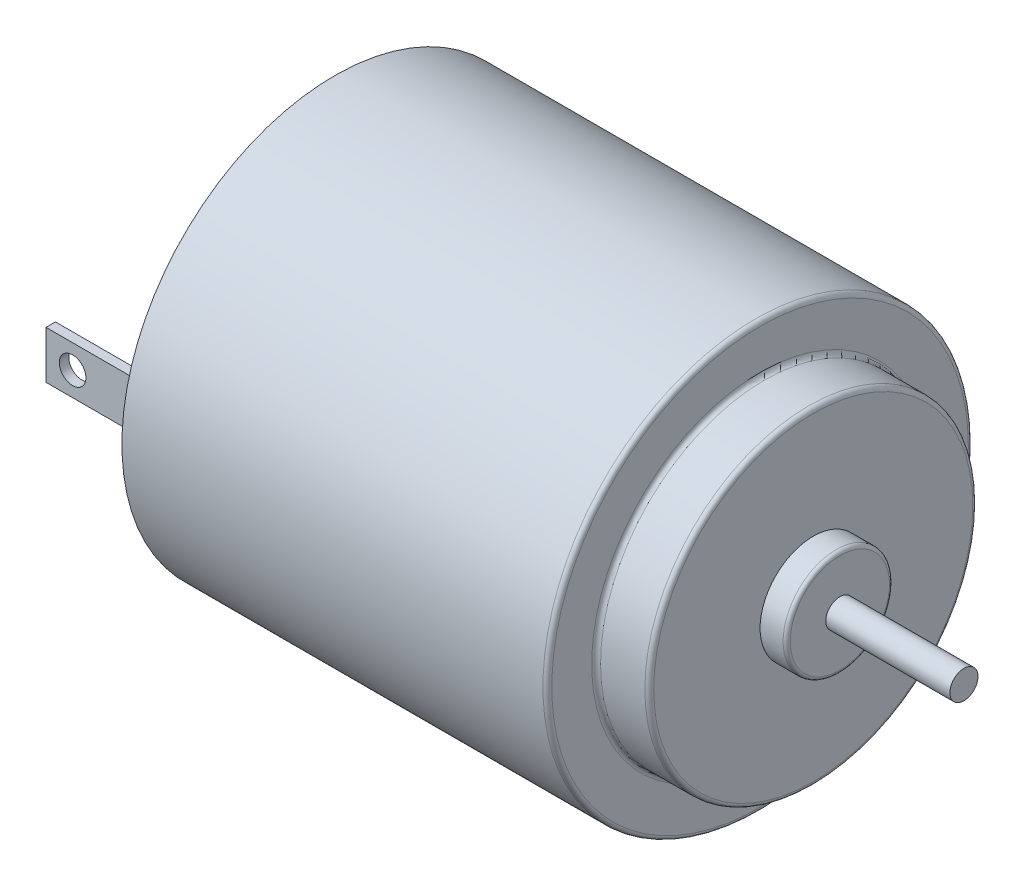
ISO-10303-21;
HEADER;
FILE_DESCRIPTION(('STEP AP214'),'2;1');
FILE_NAME('part.step','',(''),(''),'','','');
FILE_SCHEMA(('AUTOMOTIVE_DESIGN { 1 0 10303 214 1 1 1 1 }'));
ENDSEC;
DATA;
#1=APPLICATION_CONTEXT('core data for automotive mechanical design processes');
#2=APPLICATION_PROTOCOL_DEFINITION('international standard','automotive_design',2000,#1);
#3=PRODUCT_CONTEXT('',#1,'mechanical');
#4=PRODUCT('Part','Part','',(#3));
#5=PRODUCT_RELATED_PRODUCT_CATEGORY('part','',(#4));
#6=PRODUCT_DEFINITION_FORMATION('','',#4);
#7=PRODUCT_DEFINITION_CONTEXT('part definition',#1,'design');
#8=PRODUCT_DEFINITION('design','',#6,#7);
#9=PRODUCT_DEFINITION_SHAPE('','',#8);
#10=(LENGTH_UNIT() NAMED_UNIT(*) SI_UNIT(.MILLI.,.METRE.));
#11=(NAMED_UNIT(*) PLANE_ANGLE_UNIT() SI_UNIT($,.RADIAN.));
#12=(NAMED_UNIT(*) SI_UNIT($,.STERADIAN.) SOLID_ANGLE_UNIT());
#13=UNCERTAINTY_MEASURE_WITH_UNIT(LENGTH_MEASURE(1.E-05),#10,'distance_accuracy_value','');
#14=(GEOMETRIC_REPRESENTATION_CONTEXT(3) GLOBAL_UNCERTAINTY_ASSIGNED_CONTEXT((#13)) GLOBAL_UNIT_ASSIGNED_CONTEXT((#10,
#11,#12)) REPRESENTATION_CONTEXT('',''));
#15=CARTESIAN_POINT('',(0.,0.,0.));
#16=DIRECTION('',(0.,0.,1.));
#17=DIRECTION('',(1.,0.,0.));
#18=AXIS2_PLACEMENT_3D('',#15,#16,#17);
#19=CARTESIAN_POINT('',(-12.,0.,0.));
#20=DIRECTION('',(1.,0.,0.));
#21=DIRECTION('',(0.,0.,-1.));
#22=AXIS2_PLACEMENT_3D('',#19,#20,#21);
#23=PLANE('',#22);
#24=DIRECTION('',(0.,0.,-1.));
#25=VECTOR('',#24,1.);
#26=CARTESIAN_POINT('',(-12.,-1.34393994102311,-9.25));
#27=LINE('',#26,#25);
#28=CARTESIAN_POINT('',(-12.,-1.34393994102311,-9.25));
#29=VERTEX_POINT('',#28);
#30=CARTESIAN_POINT('',(-12.,-1.34393994102311,-9.7828248000751));
#31=VERTEX_POINT('',#30);
#32=EDGE_CURVE('E135',#29,#31,#27,.T.);
#33=ORIENTED_EDGE('',*,*,#32,.T.);
#34=DIRECTION('',(0.,1.,0.));
#35=VECTOR('',#34,1.);
#36=CARTESIAN_POINT('',(-12.,-1.34393994102311,-9.7828248000751));
#37=LINE('',#36,#35);
#38=CARTESIAN_POINT('',(-12.,1.34393994102311,-9.7828248000751));
#39=VERTEX_POINT('',#38);
#40=EDGE_CURVE('E108',#31,#39,#37,.T.);
#41=ORIENTED_EDGE('',*,*,#40,.T.);
#42=DIRECTION('',(0.,0.,1.));
#43=VECTOR('',#42,1.);
#44=CARTESIAN_POINT('',(-12.,1.34393994102311,-9.25));
#45=LINE('',#44,#43);
#46=CARTESIAN_POINT('',(-12.,1.34393994102311,-9.25));
#47=VERTEX_POINT('',#46);
#48=EDGE_CURVE('E124',#39,#47,#45,.T.);
#49=ORIENTED_EDGE('',*,*,#48,.T.);
#50=DIRECTION('',(0.,-1.,0.));
#51=VECTOR('',#50,1.);
#52=CARTESIAN_POINT('',(-12.,-1.34393994102311,-9.25));
#53=LINE('',#52,#51);
#54=EDGE_CURVE('E52',#47,#29,#53,.T.);
#55=ORIENTED_EDGE('',*,*,#54,.T.);
#56=EDGE_LOOP('',(#33,#41,#49,#55));
#57=FACE_BOUND('',#56,.T.);
#58=CARTESIAN_POINT('',(-12.,0.,0.));
#59=DIRECTION('',(1.,0.,0.));
#60=DIRECTION('',(0.,0.,-1.));
#61=AXIS2_PLACEMENT_3D('',#58,#59,#60);
#62=CIRCLE('',#61,12.);
#63=CARTESIAN_POINT('',(-12.,0.,-12.));
#64=VERTEX_POINT('',#63);
#65=EDGE_CURVE('E183',#64,#64,#62,.T.);
#66=ORIENTED_EDGE('',*,*,#65,.F.);
#67=EDGE_LOOP('',(#66));
#68=FACE_BOUND('',#67,.T.);
#69=DIRECTION('',(0.,1.,0.));
#70=VECTOR('',#69,1.);
#71=CARTESIAN_POINT('',(-12.,-1.34393994102311,9.7828248000751));
#72=LINE('',#71,#70);
#73=CARTESIAN_POINT('',(-12.,-1.34393994102311,9.7828248000751));
#74=VERTEX_POINT('',#73);
#75=CARTESIAN_POINT('',(-12.,1.34393994102311,9.7828248000751));
#76=VERTEX_POINT('',#75);
#77=EDGE_CURVE('E113',#74,#76,#72,.T.);
#78=ORIENTED_EDGE('',*,*,#77,.F.);
#79=DIRECTION('',(0.,0.,1.));
#80=VECTOR('',#79,1.);
#81=CARTESIAN_POINT('',(-12.,-1.34393994102311,9.25));
#82=LINE('',#81,#80);
#83=CARTESIAN_POINT('',(-12.,-1.34393994102311,9.25));
#84=VERTEX_POINT('',#83);
#85=EDGE_CURVE('E149',#84,#74,#82,.T.);
#86=ORIENTED_EDGE('',*,*,#85,.F.);
#87=DIRECTION('',(0.,-1.,0.));
#88=VECTOR('',#87,1.);
#89=CARTESIAN_POINT('',(-12.,-1.34393994102311,9.25));
#90=LINE('',#89,#88);
#91=CARTESIAN_POINT('',(-12.,1.34393994102311,9.25));
#92=VERTEX_POINT('',#91);
#93=EDGE_CURVE('E159',#92,#84,#90,.T.);
#94=ORIENTED_EDGE('',*,*,#93,.F.);
#95=DIRECTION('',(0.,0.,-1.));
#96=VECTOR('',#95,1.);
#97=CARTESIAN_POINT('',(-12.,1.34393994102311,9.25));
#98=LINE('',#97,#96);
#99=EDGE_CURVE('E60',#76,#92,#98,.T.);
#100=ORIENTED_EDGE('',*,*,#99,.F.);
#101=EDGE_LOOP('',(#78,#86,#94,#100));
#102=FACE_BOUND('',#101,.T.);
#103=ADVANCED_FACE('F36',(#57,#68,#102),#23,.F.);
#104=CARTESIAN_POINT('',(16.5,0.,0.));
#105=DIRECTION('',(1.,0.,0.));
#106=DIRECTION('',(0.,0.,-1.));
#107=AXIS2_PLACEMENT_3D('',#104,#105,#106);
#108=PLANE('',#107);
#109=CARTESIAN_POINT('',(16.5,0.,0.));
#110=DIRECTION('',(1.,0.,0.));
#111=DIRECTION('',(0.,0.,-1.));
#112=AXIS2_PLACEMENT_3D('',#109,#110,#111);
#113=CIRCLE('',#112,2.8);
#114=CARTESIAN_POINT('',(16.5,0.,-2.8));
#115=VERTEX_POINT('',#114);
#116=EDGE_CURVE('E45',#115,#115,#113,.T.);
#117=ORIENTED_EDGE('',*,*,#116,.T.);
#118=EDGE_LOOP('',(#117));
#119=FACE_BOUND('',#118,.T.);
#120=CARTESIAN_POINT('',(16.5,0.,0.));
#121=DIRECTION('',(1.,0.,0.));
#122=DIRECTION('',(0.,0.,-1.));
#123=AXIS2_PLACEMENT_3D('',#120,#121,#122);
#124=CIRCLE('',#123,0.79375);
#125=CARTESIAN_POINT('',(16.5,0.,-0.79375));
#126=VERTEX_POINT('',#125);
#127=EDGE_CURVE('E174',#126,#126,#124,.T.);
#128=ORIENTED_EDGE('',*,*,#127,.F.);
#129=EDGE_LOOP('',(#128));
#130=FACE_BOUND('',#129,.T.);
#131=ADVANCED_FACE('F207',(#119,#130),#108,.T.);
#132=CARTESIAN_POINT('',(15.,0.,0.));
#133=DIRECTION('',(1.,0.,0.));
#134=DIRECTION('',(0.,0.,-1.));
#135=AXIS2_PLACEMENT_3D('',#132,#133,#134);
#136=PLANE('',#135);
#137=CARTESIAN_POINT('',(15.,0.,0.));
#138=DIRECTION('',(1.,0.,0.));
#139=DIRECTION('',(0.,0.,-1.));
#140=AXIS2_PLACEMENT_3D('',#137,#138,#139);
#141=CIRCLE('',#140,9.);
#142=CARTESIAN_POINT('',(15.,0.,-9.));
#143=VERTEX_POINT('',#142);
#144=EDGE_CURVE('E186',#143,#143,#141,.T.);
#145=ORIENTED_EDGE('',*,*,#144,.T.);
#146=EDGE_LOOP('',(#145));
#147=FACE_BOUND('',#146,.T.);
#148=CARTESIAN_POINT('',(15.,0.,0.));
#149=DIRECTION('',(1.,0.,0.));
#150=DIRECTION('',(0.,0.,-1.));
#151=AXIS2_PLACEMENT_3D('',#148,#149,#150);
#152=CIRCLE('',#151,3.);
#153=CARTESIAN_POINT('',(15.,0.,-3.));
#154=VERTEX_POINT('',#153);
#155=EDGE_CURVE('E178',#154,#154,#152,.T.);
#156=ORIENTED_EDGE('',*,*,#155,.F.);
#157=EDGE_LOOP('',(#156));
#158=FACE_BOUND('',#157,.T.);
#159=ADVANCED_FACE('F230',(#147,#158),#136,.T.);
#160=CARTESIAN_POINT('',(12.,0.,0.));
#161=DIRECTION('',(1.,0.,0.));
#162=DIRECTION('',(0.,0.,-1.));
#163=AXIS2_PLACEMENT_3D('',#160,#161,#162);
#164=PLANE('',#163);
#165=CARTESIAN_POINT('',(12.,0.,0.));
#166=DIRECTION('',(1.,0.,0.));
#167=DIRECTION('',(0.,0.,-1.));
#168=AXIS2_PLACEMENT_3D('',#165,#166,#167);
#169=CIRCLE('',#168,9.5);
#170=CARTESIAN_POINT('',(12.,0.,-9.5));
#171=VERTEX_POINT('',#170);
#172=EDGE_CURVE('E198',#171,#171,#169,.F.);
#173=ORIENTED_EDGE('',*,*,#172,.T.);
#174=EDGE_LOOP('',(#173));
#175=FACE_BOUND('',#174,.T.);
#176=CARTESIAN_POINT('',(12.,0.,0.));
#177=DIRECTION('',(1.,0.,0.));
#178=DIRECTION('',(0.,0.,-1.));
#179=AXIS2_PLACEMENT_3D('',#176,#177,#178);
#180=CIRCLE('',#179,11.75);
#181=CARTESIAN_POINT('',(12.,0.,-11.75));
#182=VERTEX_POINT('',#181);
#183=EDGE_CURVE('E195',#182,#182,#180,.T.);
#184=ORIENTED_EDGE('',*,*,#183,.T.);
#185=EDGE_LOOP('',(#184));
#186=FACE_BOUND('',#185,.T.);
#187=ADVANCED_FACE('F235',(#175,#186),#164,.T.);
#188=CARTESIAN_POINT('',(-12.,0.,0.));
#189=DIRECTION('',(1.,0.,0.));
#190=DIRECTION('',(0.,0.,-1.));
#191=AXIS2_PLACEMENT_3D('',#188,#189,#190);
#192=CYLINDRICAL_SURFACE('',#191,12.);
#193=CARTESIAN_POINT('',(11.75,0.,0.));
#194=DIRECTION('',(1.,0.,0.));
#195=DIRECTION('',(0.,0.,-1.));
#196=AXIS2_PLACEMENT_3D('',#193,#194,#195);
#197=CIRCLE('',#196,12.);
#198=CARTESIAN_POINT('',(11.75,0.,-12.));
#199=VERTEX_POINT('',#198);
#200=EDGE_CURVE('E201',#199,#199,#197,.F.);
#201=ORIENTED_EDGE('',*,*,#200,.T.);
#202=EDGE_LOOP('',(#201));
#203=FACE_BOUND('',#202,.T.);
#204=ORIENTED_EDGE('',*,*,#65,.T.);
#205=EDGE_LOOP('',(#204));
#206=FACE_BOUND('',#205,.T.);
#207=ADVANCED_FACE('F237',(#203,#206),#192,.T.);
#208=CARTESIAN_POINT('',(15.,0.,0.));
#209=DIRECTION('',(-1.,0.,0.));
#210=DIRECTION('',(0.,0.,1.));
#211=AXIS2_PLACEMENT_3D('',#208,#209,#210);
#212=CYLINDRICAL_SURFACE('',#211,9.25);
#213=CARTESIAN_POINT('',(14.75,0.,0.));
#214=DIRECTION('',(1.,0.,0.));
#215=DIRECTION('',(0.,0.,-1.));
#216=AXIS2_PLACEMENT_3D('',#213,#214,#215);
#217=CIRCLE('',#216,9.25);
#218=CARTESIAN_POINT('',(14.75,0.,-9.25));
#219=VERTEX_POINT('',#218);
#220=EDGE_CURVE('E192',#219,#219,#217,.F.);
#221=ORIENTED_EDGE('',*,*,#220,.T.);
#222=EDGE_LOOP('',(#221));
#223=FACE_BOUND('',#222,.T.);
#224=CARTESIAN_POINT('',(12.25,0.,0.));
#225=DIRECTION('',(1.,0.,0.));
#226=DIRECTION('',(0.,0.,-1.));
#227=AXIS2_PLACEMENT_3D('',#224,#225,#226);
#228=CIRCLE('',#227,9.25);
#229=CARTESIAN_POINT('',(12.25,0.,-9.25));
#230=VERTEX_POINT('',#229);
#231=EDGE_CURVE('E189',#230,#230,#228,.T.);
#232=ORIENTED_EDGE('',*,*,#231,.T.);
#233=EDGE_LOOP('',(#232));
#234=FACE_BOUND('',#233,.T.);
#235=ADVANCED_FACE('F240',(#223,#234),#212,.T.);
#236=CARTESIAN_POINT('',(16.5,0.,0.));
#237=DIRECTION('',(-1.,0.,0.));
#238=DIRECTION('',(0.,0.,1.));
#239=AXIS2_PLACEMENT_3D('',#236,#237,#238);
#240=CYLINDRICAL_SURFACE('',#239,3.);
#241=CARTESIAN_POINT('',(16.3,0.,0.));
#242=DIRECTION('',(1.,0.,0.));
#243=DIRECTION('',(0.,0.,-1.));
#244=AXIS2_PLACEMENT_3D('',#241,#242,#243);
#245=CIRCLE('',#244,3.);
#246=CARTESIAN_POINT('',(16.3,0.,-3.));
#247=VERTEX_POINT('',#246);
#248=EDGE_CURVE('E11',#247,#247,#245,.F.);
#249=ORIENTED_EDGE('',*,*,#248,.T.);
#250=EDGE_LOOP('',(#249));
#251=FACE_BOUND('',#250,.T.);
#252=ORIENTED_EDGE('',*,*,#155,.T.);
#253=EDGE_LOOP('',(#252));
#254=FACE_BOUND('',#253,.T.);
#255=ADVANCED_FACE('F256',(#251,#254),#240,.T.);
#256=CARTESIAN_POINT('',(23.5,0.,0.));
#257=DIRECTION('',(-1.,0.,0.));
#258=DIRECTION('',(0.,0.,1.));
#259=AXIS2_PLACEMENT_3D('',#256,#257,#258);
#260=CYLINDRICAL_SURFACE('',#259,0.79375);
#261=CARTESIAN_POINT('',(23.5,0.,0.));
#262=DIRECTION('',(1.,0.,0.));
#263=DIRECTION('',(0.,0.,-1.));
#264=AXIS2_PLACEMENT_3D('',#261,#262,#263);
#265=CIRCLE('',#264,0.79375);
#266=CARTESIAN_POINT('',(23.5,0.,-0.79375));
#267=VERTEX_POINT('',#266);
#268=EDGE_CURVE('E175',#267,#267,#265,.T.);
#269=ORIENTED_EDGE('',*,*,#268,.F.);
#270=EDGE_LOOP('',(#269));
#271=FACE_BOUND('',#270,.T.);
#272=ORIENTED_EDGE('',*,*,#127,.T.);
#273=EDGE_LOOP('',(#272));
#274=FACE_BOUND('',#273,.T.);
#275=ADVANCED_FACE('F261',(#271,#274),#260,.T.);
#276=CARTESIAN_POINT('',(23.5,0.,0.));
#277=DIRECTION('',(1.,0.,0.));
#278=DIRECTION('',(0.,0.,-1.));
#279=AXIS2_PLACEMENT_3D('',#276,#277,#278);
#280=PLANE('',#279);
#281=ORIENTED_EDGE('',*,*,#268,.T.);
#282=EDGE_LOOP('',(#281));
#283=FACE_BOUND('',#282,.T.);
#284=ADVANCED_FACE('F245',(#283),#280,.T.);
#285=CARTESIAN_POINT('',(14.75,0.,0.));
#286=DIRECTION('',(1.,0.,0.));
#287=DIRECTION('',(0.,0.,-1.));
#288=AXIS2_PLACEMENT_3D('',#285,#286,#287);
#289=TOROIDAL_SURFACE('',#288,9.,0.25);
#290=ORIENTED_EDGE('',*,*,#220,.F.);
#291=EDGE_LOOP('',(#290));
#292=FACE_BOUND('',#291,.T.);
#293=ORIENTED_EDGE('',*,*,#144,.F.);
#294=EDGE_LOOP('',(#293));
#295=FACE_BOUND('',#294,.T.);
#296=ADVANCED_FACE('F242',(#292,#295),#289,.T.);
#297=CARTESIAN_POINT('',(12.25,0.,0.));
#298=DIRECTION('',(1.,0.,0.));
#299=DIRECTION('',(0.,0.,-1.));
#300=AXIS2_PLACEMENT_3D('',#297,#298,#299);
#301=TOROIDAL_SURFACE('',#300,9.5,0.25);
#302=ORIENTED_EDGE('',*,*,#172,.F.);
#303=EDGE_LOOP('',(#302));
#304=FACE_BOUND('',#303,.T.);
#305=ORIENTED_EDGE('',*,*,#231,.F.);
#306=EDGE_LOOP('',(#305));
#307=FACE_BOUND('',#306,.T.);
#308=ADVANCED_FACE('F221',(#304,#307),#301,.F.);
#309=CARTESIAN_POINT('',(11.75,0.,0.));
#310=DIRECTION('',(1.,0.,0.));
#311=DIRECTION('',(0.,0.,-1.));
#312=AXIS2_PLACEMENT_3D('',#309,#310,#311);
#313=TOROIDAL_SURFACE('',#312,11.75,0.25);
#314=ORIENTED_EDGE('',*,*,#200,.F.);
#315=EDGE_LOOP('',(#314));
#316=FACE_BOUND('',#315,.T.);
#317=ORIENTED_EDGE('',*,*,#183,.F.);
#318=EDGE_LOOP('',(#317));
#319=FACE_BOUND('',#318,.T.);
#320=ADVANCED_FACE('F212',(#316,#319),#313,.T.);
#321=CARTESIAN_POINT('',(16.3,0.,0.));
#322=DIRECTION('',(1.,0.,0.));
#323=DIRECTION('',(0.,0.,-1.));
#324=AXIS2_PLACEMENT_3D('',#321,#322,#323);
#325=TOROIDAL_SURFACE('',#324,2.8,0.2);
#326=ORIENTED_EDGE('',*,*,#248,.F.);
#327=EDGE_LOOP('',(#326));
#328=FACE_BOUND('',#327,.T.);
#329=ORIENTED_EDGE('',*,*,#116,.F.);
#330=EDGE_LOOP('',(#329));
#331=FACE_BOUND('',#330,.T.);
#332=ADVANCED_FACE('F38',(#328,#331),#325,.T.);
#333=CARTESIAN_POINT('',(-18.5,-1.34393994102311,9.7828248000751));
#334=DIRECTION('',(0.,0.,-1.));
#335=DIRECTION('',(-1.,0.,0.));
#336=AXIS2_PLACEMENT_3D('',#333,#334,#335);
#337=PLANE('',#336);
#338=CARTESIAN_POINT('',(-17.,0.,9.7828248000751));
#339=DIRECTION('',(0.,0.,1.));
#340=DIRECTION('',(1.,0.,0.));
#341=AXIS2_PLACEMENT_3D('',#338,#339,#340);
#342=CIRCLE('',#341,0.750000000000002);
#343=CARTESIAN_POINT('',(-16.25,0.,9.7828248000751));
#344=VERTEX_POINT('',#343);
#345=EDGE_CURVE('E318',#344,#344,#342,.T.);
#346=ORIENTED_EDGE('',*,*,#345,.F.);
#347=EDGE_LOOP('',(#346));
#348=FACE_BOUND('',#347,.T.);
#349=ORIENTED_EDGE('',*,*,#77,.T.);
#350=DIRECTION('',(1.,0.,0.));
#351=VECTOR('',#350,1.);
#352=CARTESIAN_POINT('',(-18.5,1.34393994102311,9.7828248000751));
#353=LINE('',#352,#351);
#354=CARTESIAN_POINT('',(-18.5,1.34393994102311,9.7828248000751));
#355=VERTEX_POINT('',#354);
#356=EDGE_CURVE('E172',#355,#76,#353,.T.);
#357=ORIENTED_EDGE('',*,*,#356,.F.);
#358=DIRECTION('',(0.,1.,0.));
#359=VECTOR('',#358,1.);
#360=CARTESIAN_POINT('',(-18.5,-1.34393994102311,9.7828248000751));
#361=LINE('',#360,#359);
#362=CARTESIAN_POINT('',(-18.5,-1.34393994102311,9.7828248000751));
#363=VERTEX_POINT('',#362);
#364=EDGE_CURVE('E145',#363,#355,#361,.T.);
#365=ORIENTED_EDGE('',*,*,#364,.F.);
#366=DIRECTION('',(1.,0.,0.));
#367=VECTOR('',#366,1.);
#368=CARTESIAN_POINT('',(-18.5,-1.34393994102311,9.7828248000751));
#369=LINE('',#368,#367);
#370=EDGE_CURVE('E155',#363,#74,#369,.T.);
#371=ORIENTED_EDGE('',*,*,#370,.T.);
#372=EDGE_LOOP('',(#349,#357,#365,#371));
#373=FACE_BOUND('',#372,.T.);
#374=ADVANCED_FACE('F211',(#348,#373),#337,.F.);
#375=CARTESIAN_POINT('',(-18.5,1.34393994102311,9.25));
#376=DIRECTION('',(0.,-1.,0.));
#377=DIRECTION('',(0.,0.,-1.));
#378=AXIS2_PLACEMENT_3D('',#375,#376,#377);
#379=PLANE('',#378);
#380=ORIENTED_EDGE('',*,*,#99,.T.);
#381=DIRECTION('',(1.,0.,0.));
#382=VECTOR('',#381,1.);
#383=CARTESIAN_POINT('',(-18.5,1.34393994102311,9.25));
#384=LINE('',#383,#382);
#385=CARTESIAN_POINT('',(-18.5,1.34393994102311,9.25));
#386=VERTEX_POINT('',#385);
#387=EDGE_CURVE('E169',#386,#92,#384,.T.);
#388=ORIENTED_EDGE('',*,*,#387,.F.);
#389=DIRECTION('',(0.,0.,-1.));
#390=VECTOR('',#389,1.);
#391=CARTESIAN_POINT('',(-18.5,1.34393994102311,9.25));
#392=LINE('',#391,#390);
#393=EDGE_CURVE('E148',#355,#386,#392,.T.);
#394=ORIENTED_EDGE('',*,*,#393,.F.);
#395=ORIENTED_EDGE('',*,*,#356,.T.);
#396=EDGE_LOOP('',(#380,#388,#394,#395));
#397=FACE_BOUND('',#396,.T.);
#398=ADVANCED_FACE('F218',(#397),#379,.F.);
#399=CARTESIAN_POINT('',(-18.5,-1.34393994102311,9.25));
#400=DIRECTION('',(0.,0.,1.));
#401=DIRECTION('',(1.,0.,0.));
#402=AXIS2_PLACEMENT_3D('',#399,#400,#401);
#403=PLANE('',#402);
#404=CARTESIAN_POINT('',(-17.,0.,9.25));
#405=DIRECTION('',(0.,0.,1.));
#406=DIRECTION('',(1.,0.,0.));
#407=AXIS2_PLACEMENT_3D('',#404,#405,#406);
#408=CIRCLE('',#407,0.750000000000002);
#409=CARTESIAN_POINT('',(-16.25,0.,9.25));
#410=VERTEX_POINT('',#409);
#411=EDGE_CURVE('E136',#410,#410,#408,.T.);
#412=ORIENTED_EDGE('',*,*,#411,.T.);
#413=EDGE_LOOP('',(#412));
#414=FACE_BOUND('',#413,.T.);
#415=ORIENTED_EDGE('',*,*,#93,.T.);
#416=DIRECTION('',(1.,0.,0.));
#417=VECTOR('',#416,1.);
#418=CARTESIAN_POINT('',(-18.5,-1.34393994102311,9.25));
#419=LINE('',#418,#417);
#420=CARTESIAN_POINT('',(-18.5,-1.34393994102311,9.25));
#421=VERTEX_POINT('',#420);
#422=EDGE_CURVE('E166',#421,#84,#419,.T.);
#423=ORIENTED_EDGE('',*,*,#422,.F.);
#424=DIRECTION('',(0.,-1.,0.));
#425=VECTOR('',#424,1.);
#426=CARTESIAN_POINT('',(-18.5,-1.34393994102311,9.25));
#427=LINE('',#426,#425);
#428=EDGE_CURVE('E151',#386,#421,#427,.T.);
#429=ORIENTED_EDGE('',*,*,#428,.F.);
#430=ORIENTED_EDGE('',*,*,#387,.T.);
#431=EDGE_LOOP('',(#415,#423,#429,#430));
#432=FACE_BOUND('',#431,.T.);
#433=ADVANCED_FACE('F276',(#414,#432),#403,.F.);
#434=CARTESIAN_POINT('',(-18.5,-1.34393994102311,9.25));
#435=DIRECTION('',(0.,1.,0.));
#436=DIRECTION('',(0.,0.,1.));
#437=AXIS2_PLACEMENT_3D('',#434,#435,#436);
#438=PLANE('',#437);
#439=ORIENTED_EDGE('',*,*,#85,.T.);
#440=ORIENTED_EDGE('',*,*,#370,.F.);
#441=DIRECTION('',(0.,0.,1.));
#442=VECTOR('',#441,1.);
#443=CARTESIAN_POINT('',(-18.5,-1.34393994102311,9.25));
#444=LINE('',#443,#442);
#445=EDGE_CURVE('E153',#421,#363,#444,.T.);
#446=ORIENTED_EDGE('',*,*,#445,.F.);
#447=ORIENTED_EDGE('',*,*,#422,.T.);
#448=EDGE_LOOP('',(#439,#440,#446,#447));
#449=FACE_BOUND('',#448,.T.);
#450=ADVANCED_FACE('F280',(#449),#438,.F.);
#451=CARTESIAN_POINT('',(-18.5,0.,0.));
#452=DIRECTION('',(1.,0.,0.));
#453=DIRECTION('',(0.,0.,-1.));
#454=AXIS2_PLACEMENT_3D('',#451,#452,#453);
#455=PLANE('',#454);
#456=ORIENTED_EDGE('',*,*,#364,.T.);
#457=ORIENTED_EDGE('',*,*,#393,.T.);
#458=ORIENTED_EDGE('',*,*,#428,.T.);
#459=ORIENTED_EDGE('',*,*,#445,.T.);
#460=EDGE_LOOP('',(#456,#457,#458,#459));
#461=FACE_BOUND('',#460,.T.);
#462=ADVANCED_FACE('F284',(#461),#455,.F.);
#463=CARTESIAN_POINT('',(-18.5,-1.34393994102311,-9.7828248000751));
#464=DIRECTION('',(0.,0.,-1.));
#465=DIRECTION('',(-1.,0.,0.));
#466=AXIS2_PLACEMENT_3D('',#463,#464,#465);
#467=PLANE('',#466);
#468=CARTESIAN_POINT('',(-17.,0.,-9.7828248000751));
#469=DIRECTION('',(0.,0.,-1.));
#470=DIRECTION('',(-1.,0.,0.));
#471=AXIS2_PLACEMENT_3D('',#468,#469,#470);
#472=CIRCLE('',#471,0.750000000000002);
#473=CARTESIAN_POINT('',(-16.25,0.,-9.7828248000751));
#474=VERTEX_POINT('',#473);
#475=EDGE_CURVE('E315',#474,#474,#472,.T.);
#476=ORIENTED_EDGE('',*,*,#475,.F.);
#477=EDGE_LOOP('',(#476));
#478=FACE_BOUND('',#477,.T.);
#479=ORIENTED_EDGE('',*,*,#40,.F.);
#480=DIRECTION('',(1.,0.,0.));
#481=VECTOR('',#480,1.);
#482=CARTESIAN_POINT('',(-18.5,-1.34393994102311,-9.7828248000751));
#483=LINE('',#482,#481);
#484=CARTESIAN_POINT('',(-18.5,-1.34393994102311,-9.7828248000751));
#485=VERTEX_POINT('',#484);
#486=EDGE_CURVE('E102',#485,#31,#483,.T.);
#487=ORIENTED_EDGE('',*,*,#486,.F.);
#488=DIRECTION('',(0.,1.,0.));
#489=VECTOR('',#488,1.);
#490=CARTESIAN_POINT('',(-18.5,-1.34393994102311,-9.7828248000751));
#491=LINE('',#490,#489);
#492=CARTESIAN_POINT('',(-18.5,1.34393994102311,-9.7828248000751));
#493=VERTEX_POINT('',#492);
#494=EDGE_CURVE('E105',#485,#493,#491,.T.);
#495=ORIENTED_EDGE('',*,*,#494,.T.);
#496=DIRECTION('',(1.,0.,0.));
#497=VECTOR('',#496,1.);
#498=CARTESIAN_POINT('',(-18.5,1.34393994102311,-9.7828248000751));
#499=LINE('',#498,#497);
#500=EDGE_CURVE('E133',#493,#39,#499,.T.);
#501=ORIENTED_EDGE('',*,*,#500,.T.);
#502=EDGE_LOOP('',(#479,#487,#495,#501));
#503=FACE_BOUND('',#502,.T.);
#504=ADVANCED_FACE('F104',(#478,#503),#467,.T.);
#505=CARTESIAN_POINT('',(-18.5,-1.34393994102311,-9.25));
#506=DIRECTION('',(0.,-1.,0.));
#507=DIRECTION('',(0.,0.,-1.));
#508=AXIS2_PLACEMENT_3D('',#505,#506,#507);
#509=PLANE('',#508);
#510=ORIENTED_EDGE('',*,*,#32,.F.);
#511=DIRECTION('',(1.,0.,0.));
#512=VECTOR('',#511,1.);
#513=CARTESIAN_POINT('',(-18.5,-1.34393994102311,-9.25));
#514=LINE('',#513,#512);
#515=CARTESIAN_POINT('',(-18.5,-1.34393994102311,-9.25));
#516=VERTEX_POINT('',#515);
#517=EDGE_CURVE('E114',#516,#29,#514,.T.);
#518=ORIENTED_EDGE('',*,*,#517,.F.);
#519=DIRECTION('',(0.,0.,-1.));
#520=VECTOR('',#519,1.);
#521=CARTESIAN_POINT('',(-18.5,-1.34393994102311,-9.25));
#522=LINE('',#521,#520);
#523=EDGE_CURVE('E120',#516,#485,#522,.T.);
#524=ORIENTED_EDGE('',*,*,#523,.T.);
#525=ORIENTED_EDGE('',*,*,#486,.T.);
#526=EDGE_LOOP('',(#510,#518,#524,#525));
#527=FACE_BOUND('',#526,.T.);
#528=ADVANCED_FACE('F126',(#527),#509,.T.);
#529=CARTESIAN_POINT('',(-18.5,-1.34393994102311,-9.25));
#530=DIRECTION('',(0.,0.,1.));
#531=DIRECTION('',(1.,0.,0.));
#532=AXIS2_PLACEMENT_3D('',#529,#530,#531);
#533=PLANE('',#532);
#534=CARTESIAN_POINT('',(-17.,0.,-9.25));
#535=DIRECTION('',(0.,0.,1.));
#536=DIRECTION('',(1.,0.,0.));
#537=AXIS2_PLACEMENT_3D('',#534,#535,#536);
#538=CIRCLE('',#537,0.750000000000002);
#539=CARTESIAN_POINT('',(-16.25,0.,-9.25));
#540=VERTEX_POINT('',#539);
#541=EDGE_CURVE('E40',#540,#540,#538,.T.);
#542=ORIENTED_EDGE('',*,*,#541,.F.);
#543=EDGE_LOOP('',(#542));
#544=FACE_BOUND('',#543,.T.);
#545=ORIENTED_EDGE('',*,*,#54,.F.);
#546=DIRECTION('',(1.,0.,0.));
#547=VECTOR('',#546,1.);
#548=CARTESIAN_POINT('',(-18.5,1.34393994102311,-9.25));
#549=LINE('',#548,#547);
#550=CARTESIAN_POINT('',(-18.5,1.34393994102311,-9.25));
#551=VERTEX_POINT('',#550);
#552=EDGE_CURVE('E142',#551,#47,#549,.T.);
#553=ORIENTED_EDGE('',*,*,#552,.F.);
#554=DIRECTION('',(0.,-1.,0.));
#555=VECTOR('',#554,1.);
#556=CARTESIAN_POINT('',(-18.5,-1.34393994102311,-9.25));
#557=LINE('',#556,#555);
#558=EDGE_CURVE('E127',#551,#516,#557,.T.);
#559=ORIENTED_EDGE('',*,*,#558,.T.);
#560=ORIENTED_EDGE('',*,*,#517,.T.);
#561=EDGE_LOOP('',(#545,#553,#559,#560));
#562=FACE_BOUND('',#561,.T.);
#563=ADVANCED_FACE('F294',(#544,#562),#533,.T.);
#564=CARTESIAN_POINT('',(-18.5,1.34393994102311,-9.25));
#565=DIRECTION('',(0.,1.,0.));
#566=DIRECTION('',(0.,0.,1.));
#567=AXIS2_PLACEMENT_3D('',#564,#565,#566);
#568=PLANE('',#567);
#569=ORIENTED_EDGE('',*,*,#48,.F.);
#570=ORIENTED_EDGE('',*,*,#500,.F.);
#571=DIRECTION('',(0.,0.,1.));
#572=VECTOR('',#571,1.);
#573=CARTESIAN_POINT('',(-18.5,1.34393994102311,-9.25));
#574=LINE('',#573,#572);
#575=EDGE_CURVE('E123',#493,#551,#574,.T.);
#576=ORIENTED_EDGE('',*,*,#575,.T.);
#577=ORIENTED_EDGE('',*,*,#552,.T.);
#578=EDGE_LOOP('',(#569,#570,#576,#577));
#579=FACE_BOUND('',#578,.T.);
#580=ADVANCED_FACE('F297',(#579),#568,.T.);
#581=CARTESIAN_POINT('',(-18.5,0.,0.));
#582=DIRECTION('',(1.,0.,0.));
#583=DIRECTION('',(0.,0.,1.));
#584=AXIS2_PLACEMENT_3D('',#581,#582,#583);
#585=PLANE('',#584);
#586=ORIENTED_EDGE('',*,*,#494,.F.);
#587=ORIENTED_EDGE('',*,*,#523,.F.);
#588=ORIENTED_EDGE('',*,*,#558,.F.);
#589=ORIENTED_EDGE('',*,*,#575,.F.);
#590=EDGE_LOOP('',(#586,#587,#588,#589));
#591=FACE_BOUND('',#590,.T.);
#592=ADVANCED_FACE('F118',(#591),#585,.F.);
#593=CARTESIAN_POINT('',(-17.,0.,-12.));
#594=DIRECTION('',(0.,0.,1.));
#595=DIRECTION('',(1.,0.,0.));
#596=AXIS2_PLACEMENT_3D('',#593,#594,#595);
#597=CYLINDRICAL_SURFACE('',#596,0.750000000000002);
#598=CARTESIAN_POINT('',(-16.25,0.,-9.7828248000751));
#599=CARTESIAN_POINT('',(-16.25,0.,-9.77727454174099));
#600=CARTESIAN_POINT('',(-16.25,0.,-9.77172428340687));
#601=CARTESIAN_POINT('',(-16.25,0.,-9.76062376673864));
#602=CARTESIAN_POINT('',(-16.25,0.,-9.75507350840453));
#603=CARTESIAN_POINT('',(-16.25,0.,-9.74397299173629));
#604=CARTESIAN_POINT('',(-16.25,0.,-9.73842273340218));
#605=CARTESIAN_POINT('',(-16.25,0.,-9.72732221673395));
#606=CARTESIAN_POINT('',(-16.25,0.,-9.72177195839983));
#607=CARTESIAN_POINT('',(-16.25,0.,-9.7106714417316));
#608=CARTESIAN_POINT('',(-16.25,0.,-9.70512118339748));
#609=CARTESIAN_POINT('',(-16.25,0.,-9.69402066672925));
#610=CARTESIAN_POINT('',(-16.25,0.,-9.68847040839514));
#611=CARTESIAN_POINT('',(-16.25,0.,-9.67736989172691));
#612=CARTESIAN_POINT('',(-16.25,0.,-9.67181963339279));
#613=CARTESIAN_POINT('',(-16.25,0.,-9.66071911672456));
#614=CARTESIAN_POINT('',(-16.25,0.,-9.65516885839044));
#615=CARTESIAN_POINT('',(-16.25,0.,-9.64406834172221));
#616=CARTESIAN_POINT('',(-16.25,0.,-9.6385180833881));
#617=CARTESIAN_POINT('',(-16.25,0.,-9.62741756671987));
#618=CARTESIAN_POINT('',(-16.25,0.,-9.62186730838575));
#619=CARTESIAN_POINT('',(-16.25,0.,-9.61076679171752));
#620=CARTESIAN_POINT('',(-16.25,0.,-9.6052165333834));
#621=CARTESIAN_POINT('',(-16.25,0.,-9.59411601671517));
#622=CARTESIAN_POINT('',(-16.25,0.,-9.58856575838106));
#623=CARTESIAN_POINT('',(-16.25,0.,-9.57746524171282));
#624=CARTESIAN_POINT('',(-16.25,0.,-9.57191498337871));
#625=CARTESIAN_POINT('',(-16.25,0.,-9.56081446671048));
#626=CARTESIAN_POINT('',(-16.25,0.,-9.55526420837636));
#627=CARTESIAN_POINT('',(-16.25,0.,-9.54416369170813));
#628=CARTESIAN_POINT('',(-16.25,0.,-9.53861343337402));
#629=CARTESIAN_POINT('',(-16.25,0.,-9.52751291670578));
#630=CARTESIAN_POINT('',(-16.25,0.,-9.52196265837167));
#631=CARTESIAN_POINT('',(-16.25,0.,-9.51086214170344));
#632=CARTESIAN_POINT('',(-16.25,0.,-9.50531188336932));
#633=CARTESIAN_POINT('',(-16.25,0.,-9.49421136670109));
#634=CARTESIAN_POINT('',(-16.25,0.,-9.48866110836697));
#635=CARTESIAN_POINT('',(-16.25,0.,-9.47756059169874));
#636=CARTESIAN_POINT('',(-16.25,0.,-9.47201033336463));
#637=CARTESIAN_POINT('',(-16.25,0.,-9.46090981669639));
#638=CARTESIAN_POINT('',(-16.25,0.,-9.45535955836228));
#639=CARTESIAN_POINT('',(-16.25,0.,-9.44425904169405));
#640=CARTESIAN_POINT('',(-16.25,0.,-9.43870878335993));
#641=CARTESIAN_POINT('',(-16.25,0.,-9.4276082666917));
#642=CARTESIAN_POINT('',(-16.25,0.,-9.42205800835759));
#643=CARTESIAN_POINT('',(-16.25,0.,-9.41095749168935));
#644=CARTESIAN_POINT('',(-16.25,0.,-9.40540723335524));
#645=CARTESIAN_POINT('',(-16.25,0.,-9.39430671668701));
#646=CARTESIAN_POINT('',(-16.25,0.,-9.38875645835289));
#647=CARTESIAN_POINT('',(-16.25,0.,-9.37765594168466));
#648=CARTESIAN_POINT('',(-16.25,0.,-9.37210568335055));
#649=CARTESIAN_POINT('',(-16.25,0.,-9.36100516668231));
#650=CARTESIAN_POINT('',(-16.25,0.,-9.3554549083482));
#651=CARTESIAN_POINT('',(-16.25,0.,-9.34435439167997));
#652=CARTESIAN_POINT('',(-16.25,0.,-9.33880413334585));
#653=CARTESIAN_POINT('',(-16.25,0.,-9.32770361667762));
#654=CARTESIAN_POINT('',(-16.25,0.,-9.3221533583435));
#655=CARTESIAN_POINT('',(-16.25,0.,-9.31105284167527));
#656=CARTESIAN_POINT('',(-16.25,0.,-9.30550258334116));
#657=CARTESIAN_POINT('',(-16.25,0.,-9.29440206667293));
#658=CARTESIAN_POINT('',(-16.25,0.,-9.28885180833881));
#659=CARTESIAN_POINT('',(-16.25,0.,-9.27775129167058));
#660=CARTESIAN_POINT('',(-16.25,0.,-9.27220103333647));
#661=CARTESIAN_POINT('',(-16.25,0.,-9.26110051666823));
#662=CARTESIAN_POINT('',(-16.25,0.,-9.25555025833412));
#663=CARTESIAN_POINT('',(-16.25,0.,-9.25));
#664=B_SPLINE_CURVE_WITH_KNOTS('',3,(#598,#599,#600,#601,#602,#603,#604,#605,#606,#607,#608,
#609,#610,#611,#612,#613,#614,#615,#616,#617,#618,#619,#620,#621,#622,#623,#624,#625,#626,#627,
#628,#629,#630,#631,#632,#633,#634,#635,#636,#637,#638,#639,#640,#641,#642,#643,#644,#645,#646,
#647,#648,#649,#650,#651,#652,#653,#654,#655,#656,#657,#658,#659,#660,#661,#662,#663),
.UNSPECIFIED.,.F.,.F.,(4,2,2,2,2,2,2,2,2,2,2,2,2,2,2,2,2,2,2,2,2,2,2,2,2,2,2,2,2,2,2,2,4),(0.,
0.016650775002347,0.033301550004694,0.0499523250070411,0.0666031000093881,0.0832538750117334,
0.0999046500140804,0.116555425016427,0.133206200018774,0.149856975021121,0.166507750023468,
0.183158525025815,0.199809300028162,0.21646007503051,0.233110850032857,0.249761625035204,
0.266412400037551,0.283063175039898,0.299713950042245,0.316364725044592,0.333015500046939,
0.349666275049286,0.366317050051633,0.38296782505398,0.399618600056327,0.416269375058674,
0.432920150061021,0.449570925063368,0.466221700065713,0.48287247506806,0.499523250070407,
0.516174025072754,0.532824800075101),.UNSPECIFIED.);
#665=EDGE_CURVE('BSEAM304',#474,#540,#664,.T.);
#666=ORIENTED_EDGE('',*,*,#475,.T.);
#667=ORIENTED_EDGE('',*,*,#541,.T.);
#668=ORIENTED_EDGE('',*,*,#665,.T.);
#669=ORIENTED_EDGE('',*,*,#665,.F.);
#670=EDGE_LOOP('',(#666,#668,#667,#669));
#671=FACE_BOUND('',#670,.T.);
#672=ADVANCED_FACE('F304',(#671),#597,.F.);
#673=ORIENTED_EDGE('',*,*,#345,.T.);
#674=EDGE_LOOP('',(#673));
#675=FACE_BOUND('',#674,.T.);
#676=ORIENTED_EDGE('',*,*,#411,.F.);
#677=EDGE_LOOP('',(#676));
#678=FACE_BOUND('',#677,.T.);
#679=ADVANCED_FACE('F306',(#675,#678),#597,.F.);
#680=CLOSED_SHELL('',(#103,#131,#159,#187,#207,#235,#255,#275,#284,#296,#308,#320,#332,#374,
#398,#433,#450,#462,#504,#528,#563,#580,#592,#672,#679));
#681=MANIFOLD_SOLID_BREP('B2',#680);
#682=ADVANCED_BREP_SHAPE_REPRESENTATION('',(#18,#681),#14);
#683=SHAPE_DEFINITION_REPRESENTATION(#9,#682);
ENDSEC;
END-ISO-10303-21;
